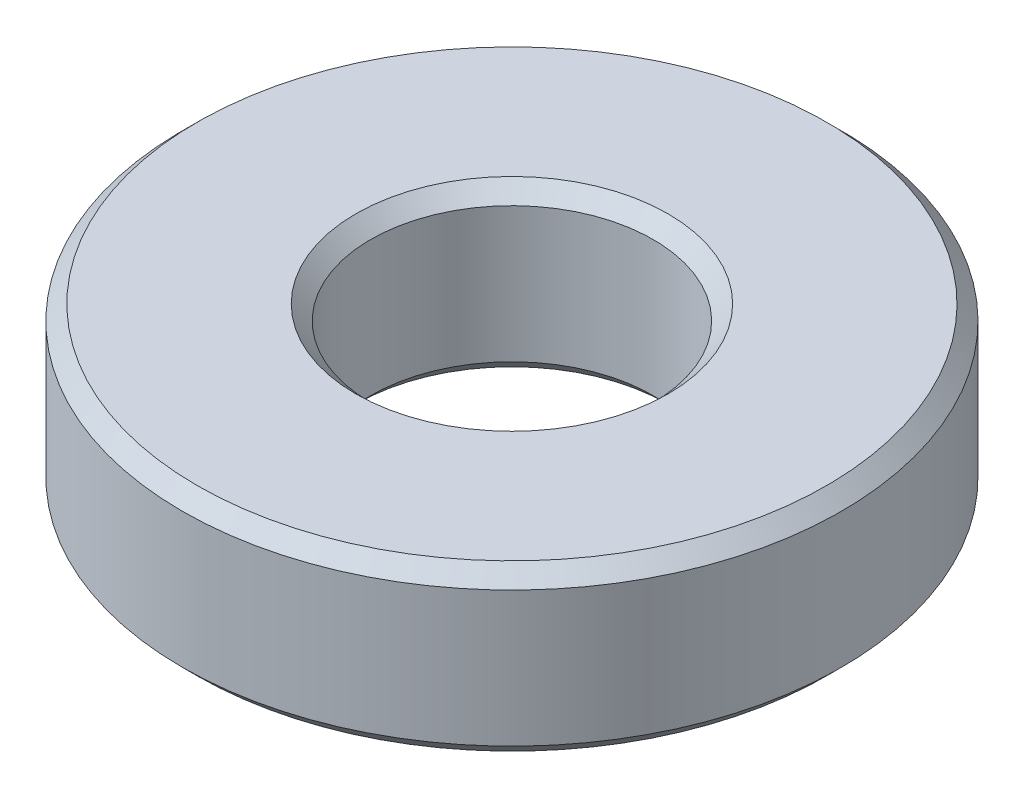
ISO-10303-21;
HEADER;
FILE_DESCRIPTION(('STEP AP214'),'2;1');
FILE_NAME('part.step','',(''),(''),'','','');
FILE_SCHEMA(('AUTOMOTIVE_DESIGN { 1 0 10303 214 1 1 1 1 }'));
ENDSEC;
DATA;
#1=APPLICATION_CONTEXT('core data for automotive mechanical design processes');
#2=APPLICATION_PROTOCOL_DEFINITION('international standard','automotive_design',2000,#1);
#3=PRODUCT_CONTEXT('',#1,'mechanical');
#4=PRODUCT('Part','Part','',(#3));
#5=PRODUCT_RELATED_PRODUCT_CATEGORY('part','',(#4));
#6=PRODUCT_DEFINITION_FORMATION('','',#4);
#7=PRODUCT_DEFINITION_CONTEXT('part definition',#1,'design');
#8=PRODUCT_DEFINITION('design','',#6,#7);
#9=PRODUCT_DEFINITION_SHAPE('','',#8);
#10=(LENGTH_UNIT() NAMED_UNIT(*) SI_UNIT(.MILLI.,.METRE.));
#11=(NAMED_UNIT(*) PLANE_ANGLE_UNIT() SI_UNIT($,.RADIAN.));
#12=(NAMED_UNIT(*) SI_UNIT($,.STERADIAN.) SOLID_ANGLE_UNIT());
#13=UNCERTAINTY_MEASURE_WITH_UNIT(LENGTH_MEASURE(1.E-05),#10,'distance_accuracy_value','');
#14=(GEOMETRIC_REPRESENTATION_CONTEXT(3) GLOBAL_UNCERTAINTY_ASSIGNED_CONTEXT((#13)) GLOBAL_UNIT_ASSIGNED_CONTEXT((#10,
#11,#12)) REPRESENTATION_CONTEXT('',''));
#15=CARTESIAN_POINT('',(0.,0.,0.));
#16=DIRECTION('',(0.,0.,1.));
#17=DIRECTION('',(1.,0.,0.));
#18=AXIS2_PLACEMENT_3D('',#15,#16,#17);
#19=CARTESIAN_POINT('',(0.,2.779,0.));
#20=DIRECTION('',(0.,1.,0.));
#21=DIRECTION('',(0.,0.,1.));
#22=AXIS2_PLACEMENT_3D('',#19,#20,#21);
#23=PLANE('',#22);
#24=CARTESIAN_POINT('',(0.,2.779,0.));
#25=DIRECTION('',(0.,1.,0.));
#26=DIRECTION('',(0.,0.,1.));
#27=AXIS2_PLACEMENT_3D('',#24,#25,#26);
#28=CIRCLE('',#27,5.2625);
#29=CARTESIAN_POINT('',(0.,2.779,5.2625));
#30=VERTEX_POINT('',#29);
#31=EDGE_CURVE('E10',#30,#30,#28,.F.);
#32=ORIENTED_EDGE('',*,*,#31,.T.);
#33=EDGE_LOOP('',(#32));
#34=FACE_BOUND('',#33,.T.);
#35=CARTESIAN_POINT('',(0.,2.779,0.));
#36=DIRECTION('',(0.,1.,0.));
#37=DIRECTION('',(0.,0.,1.));
#38=AXIS2_PLACEMENT_3D('',#35,#36,#37);
#39=CIRCLE('',#38,10.6125);
#40=CARTESIAN_POINT('',(0.,2.779,10.6125));
#41=VERTEX_POINT('',#40);
#42=EDGE_CURVE('E41',#41,#41,#39,.T.);
#43=ORIENTED_EDGE('',*,*,#42,.T.);
#44=EDGE_LOOP('',(#43));
#45=FACE_BOUND('',#44,.T.);
#46=ADVANCED_FACE('F33',(#34,#45),#23,.T.);
#47=CARTESIAN_POINT('',(0.,-2.779,0.));
#48=DIRECTION('',(0.,1.,0.));
#49=DIRECTION('',(0.,0.,1.));
#50=AXIS2_PLACEMENT_3D('',#47,#48,#49);
#51=PLANE('',#50);
#52=CARTESIAN_POINT('',(0.,-2.779,0.));
#53=DIRECTION('',(0.,1.,0.));
#54=DIRECTION('',(0.,0.,1.));
#55=AXIS2_PLACEMENT_3D('',#52,#53,#54);
#56=CIRCLE('',#55,5.2625);
#57=CARTESIAN_POINT('',(0.,-2.779,5.2625));
#58=VERTEX_POINT('',#57);
#59=EDGE_CURVE('E60',#58,#58,#56,.T.);
#60=ORIENTED_EDGE('',*,*,#59,.T.);
#61=EDGE_LOOP('',(#60));
#62=FACE_BOUND('',#61,.T.);
#63=CARTESIAN_POINT('',(0.,-2.779,0.));
#64=DIRECTION('',(0.,1.,0.));
#65=DIRECTION('',(0.,0.,1.));
#66=AXIS2_PLACEMENT_3D('',#63,#64,#65);
#67=CIRCLE('',#66,10.6125);
#68=CARTESIAN_POINT('',(0.,-2.779,10.6125));
#69=VERTEX_POINT('',#68);
#70=EDGE_CURVE('E63',#69,#69,#67,.F.);
#71=ORIENTED_EDGE('',*,*,#70,.T.);
#72=EDGE_LOOP('',(#71));
#73=FACE_BOUND('',#72,.T.);
#74=ADVANCED_FACE('F67',(#62,#73),#51,.F.);
#75=CARTESIAN_POINT('',(0.,2.779,0.));
#76=DIRECTION('',(0.,-1.,0.));
#77=DIRECTION('',(0.,0.,-1.));
#78=AXIS2_PLACEMENT_3D('',#75,#76,#77);
#79=CYLINDRICAL_SURFACE('',#78,11.1125);
#80=CARTESIAN_POINT('',(0.,-2.279,0.));
#81=DIRECTION('',(0.,1.,0.));
#82=DIRECTION('',(0.,0.,1.));
#83=AXIS2_PLACEMENT_3D('',#80,#81,#82);
#84=CIRCLE('',#83,11.1125);
#85=CARTESIAN_POINT('',(0.,-2.279,11.1125));
#86=VERTEX_POINT('',#85);
#87=EDGE_CURVE('E45',#86,#86,#84,.T.);
#88=ORIENTED_EDGE('',*,*,#87,.T.);
#89=EDGE_LOOP('',(#88));
#90=FACE_BOUND('',#89,.T.);
#91=CARTESIAN_POINT('',(0.,2.27900000000001,0.));
#92=DIRECTION('',(0.,1.,0.));
#93=DIRECTION('',(0.,0.,1.));
#94=AXIS2_PLACEMENT_3D('',#91,#92,#93);
#95=CIRCLE('',#94,11.1125);
#96=CARTESIAN_POINT('',(0.,2.27900000000001,11.1125));
#97=VERTEX_POINT('',#96);
#98=EDGE_CURVE('E49',#97,#97,#95,.F.);
#99=ORIENTED_EDGE('',*,*,#98,.T.);
#100=EDGE_LOOP('',(#99));
#101=FACE_BOUND('',#100,.T.);
#102=ADVANCED_FACE('F77',(#90,#101),#79,.T.);
#103=CARTESIAN_POINT('',(0.,2.779,0.));
#104=DIRECTION('',(0.,-1.,0.));
#105=DIRECTION('',(0.,0.,-1.));
#106=AXIS2_PLACEMENT_3D('',#103,#104,#105);
#107=CYLINDRICAL_SURFACE('',#106,4.7625);
#108=CARTESIAN_POINT('',(0.,-2.279,0.));
#109=DIRECTION('',(0.,1.,0.));
#110=DIRECTION('',(0.,0.,1.));
#111=AXIS2_PLACEMENT_3D('',#108,#109,#110);
#112=CIRCLE('',#111,4.7625);
#113=CARTESIAN_POINT('',(0.,-2.279,4.7625));
#114=VERTEX_POINT('',#113);
#115=EDGE_CURVE('E54',#114,#114,#112,.F.);
#116=ORIENTED_EDGE('',*,*,#115,.T.);
#117=EDGE_LOOP('',(#116));
#118=FACE_BOUND('',#117,.T.);
#119=CARTESIAN_POINT('',(0.,2.279,0.));
#120=DIRECTION('',(0.,1.,0.));
#121=DIRECTION('',(0.,0.,1.));
#122=AXIS2_PLACEMENT_3D('',#119,#120,#121);
#123=CIRCLE('',#122,4.7625);
#124=CARTESIAN_POINT('',(0.,2.279,4.7625));
#125=VERTEX_POINT('',#124);
#126=EDGE_CURVE('E57',#125,#125,#123,.T.);
#127=ORIENTED_EDGE('',*,*,#126,.T.);
#128=EDGE_LOOP('',(#127));
#129=FACE_BOUND('',#128,.T.);
#130=ADVANCED_FACE('F80',(#118,#129),#107,.F.);
#131=CARTESIAN_POINT('',(0.,-2.779,0.));
#132=DIRECTION('',(0.,-1.,0.));
#133=DIRECTION('',(0.,0.,-1.));
#134=AXIS2_PLACEMENT_3D('',#131,#132,#133);
#135=CONICAL_SURFACE('',#134,5.2625,0.785398163397448);
#136=ORIENTED_EDGE('',*,*,#115,.F.);
#137=EDGE_LOOP('',(#136));
#138=FACE_BOUND('',#137,.T.);
#139=ORIENTED_EDGE('',*,*,#59,.F.);
#140=EDGE_LOOP('',(#139));
#141=FACE_BOUND('',#140,.T.);
#142=ADVANCED_FACE('F73',(#138,#141),#135,.F.);
#143=CARTESIAN_POINT('',(0.,-2.279,0.));
#144=DIRECTION('',(0.,1.,0.));
#145=DIRECTION('',(0.,0.,1.));
#146=AXIS2_PLACEMENT_3D('',#143,#144,#145);
#147=CONICAL_SURFACE('',#146,11.1125,0.785398163397452);
#148=ORIENTED_EDGE('',*,*,#70,.F.);
#149=EDGE_LOOP('',(#148));
#150=FACE_BOUND('',#149,.T.);
#151=ORIENTED_EDGE('',*,*,#87,.F.);
#152=EDGE_LOOP('',(#151));
#153=FACE_BOUND('',#152,.T.);
#154=ADVANCED_FACE('F69',(#150,#153),#147,.T.);
#155=CARTESIAN_POINT('',(0.,2.279,0.));
#156=DIRECTION('',(0.,1.,0.));
#157=DIRECTION('',(0.,0.,1.));
#158=AXIS2_PLACEMENT_3D('',#155,#156,#157);
#159=CONICAL_SURFACE('',#158,4.7625,0.785398163397448);
#160=ORIENTED_EDGE('',*,*,#31,.F.);
#161=EDGE_LOOP('',(#160));
#162=FACE_BOUND('',#161,.T.);
#163=ORIENTED_EDGE('',*,*,#126,.F.);
#164=EDGE_LOOP('',(#163));
#165=FACE_BOUND('',#164,.T.);
#166=ADVANCED_FACE('F72',(#162,#165),#159,.F.);
#167=CARTESIAN_POINT('',(0.,2.779,0.));
#168=DIRECTION('',(0.,-1.,0.));
#169=DIRECTION('',(0.,0.,-1.));
#170=AXIS2_PLACEMENT_3D('',#167,#168,#169);
#171=CONICAL_SURFACE('',#170,10.6125,0.785398163397448);
#172=ORIENTED_EDGE('',*,*,#98,.F.);
#173=EDGE_LOOP('',(#172));
#174=FACE_BOUND('',#173,.T.);
#175=ORIENTED_EDGE('',*,*,#42,.F.);
#176=EDGE_LOOP('',(#175));
#177=FACE_BOUND('',#176,.T.);
#178=ADVANCED_FACE('F36',(#174,#177),#171,.T.);
#179=CLOSED_SHELL('',(#46,#74,#102,#130,#142,#154,#166,#178));
#180=MANIFOLD_SOLID_BREP('B2',#179);
#181=ADVANCED_BREP_SHAPE_REPRESENTATION('',(#18,#180),#14);
#182=SHAPE_DEFINITION_REPRESENTATION(#9,#181);
ENDSEC;
END-ISO-10303-21;
